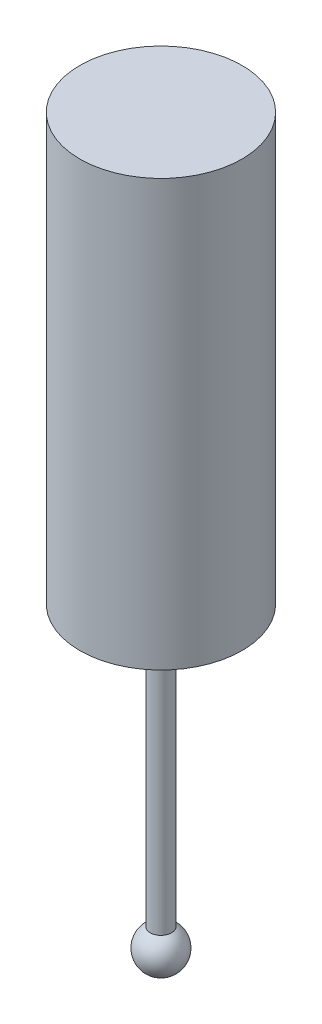
ISO-10303-21;
HEADER;
FILE_DESCRIPTION(('STEP AP214'),'2;1');
FILE_NAME('part.step','',(''),(''),'','','');
FILE_SCHEMA(('AUTOMOTIVE_DESIGN { 1 0 10303 214 1 1 1 1 }'));
ENDSEC;
DATA;
#1=APPLICATION_CONTEXT('core data for automotive mechanical design processes');
#2=APPLICATION_PROTOCOL_DEFINITION('international standard','automotive_design',2000,#1);
#3=PRODUCT_CONTEXT('',#1,'mechanical');
#4=PRODUCT('Part','Part','',(#3));
#5=PRODUCT_RELATED_PRODUCT_CATEGORY('part','',(#4));
#6=PRODUCT_DEFINITION_FORMATION('','',#4);
#7=PRODUCT_DEFINITION_CONTEXT('part definition',#1,'design');
#8=PRODUCT_DEFINITION('design','',#6,#7);
#9=PRODUCT_DEFINITION_SHAPE('','',#8);
#10=(LENGTH_UNIT() NAMED_UNIT(*) SI_UNIT(.MILLI.,.METRE.));
#11=(NAMED_UNIT(*) PLANE_ANGLE_UNIT() SI_UNIT($,.RADIAN.));
#12=(NAMED_UNIT(*) SI_UNIT($,.STERADIAN.) SOLID_ANGLE_UNIT());
#13=UNCERTAINTY_MEASURE_WITH_UNIT(LENGTH_MEASURE(1.E-05),#10,'distance_accuracy_value','');
#14=(GEOMETRIC_REPRESENTATION_CONTEXT(3) GLOBAL_UNCERTAINTY_ASSIGNED_CONTEXT((#13)) GLOBAL_UNIT_ASSIGNED_CONTEXT((#10,
#11,#12)) REPRESENTATION_CONTEXT('',''));
#15=CARTESIAN_POINT('',(0.,0.,0.));
#16=DIRECTION('',(0.,0.,1.));
#17=DIRECTION('',(1.,0.,0.));
#18=AXIS2_PLACEMENT_3D('',#15,#16,#17);
#19=CARTESIAN_POINT('',(0.,70.,0.));
#20=DIRECTION('',(0.,1.,0.));
#21=DIRECTION('',(0.,0.,1.));
#22=AXIS2_PLACEMENT_3D('',#19,#20,#21);
#23=PLANE('',#22);
#24=CARTESIAN_POINT('',(0.,70.,0.));
#25=DIRECTION('',(0.,1.,0.));
#26=DIRECTION('',(0.,0.,1.));
#27=AXIS2_PLACEMENT_3D('',#24,#25,#26);
#28=CIRCLE('',#27,19.05);
#29=CARTESIAN_POINT('',(0.,70.,19.05));
#30=VERTEX_POINT('',#29);
#31=EDGE_CURVE('E40',#30,#30,#28,.T.);
#32=ORIENTED_EDGE('',*,*,#31,.F.);
#33=EDGE_LOOP('',(#32));
#34=FACE_BOUND('',#33,.T.);
#35=CARTESIAN_POINT('',(0.,69.9999999999932,0.));
#36=DIRECTION('',(0.,1.,0.));
#37=DIRECTION('',(0.,0.,1.));
#38=AXIS2_PLACEMENT_3D('',#35,#36,#37);
#39=CIRCLE('',#38,2.5);
#40=CARTESIAN_POINT('',(0.,69.9999999999932,2.5));
#41=VERTEX_POINT('',#40);
#42=EDGE_CURVE('E10',#41,#41,#39,.F.);
#43=ORIENTED_EDGE('',*,*,#42,.F.);
#44=EDGE_LOOP('',(#43));
#45=FACE_BOUND('',#44,.T.);
#46=ADVANCED_FACE('F29',(#34,#45),#23,.F.);
#47=CARTESIAN_POINT('',(0.,170.,0.));
#48=DIRECTION('',(0.,-1.,0.));
#49=DIRECTION('',(0.,0.,-1.));
#50=AXIS2_PLACEMENT_3D('',#47,#48,#49);
#51=CYLINDRICAL_SURFACE('',#50,19.05);
#52=CARTESIAN_POINT('',(0.,170.,0.));
#53=DIRECTION('',(0.,1.,0.));
#54=DIRECTION('',(0.,0.,1.));
#55=AXIS2_PLACEMENT_3D('',#52,#53,#54);
#56=CIRCLE('',#55,19.05);
#57=CARTESIAN_POINT('',(0.,170.,19.05));
#58=VERTEX_POINT('',#57);
#59=EDGE_CURVE('E36',#58,#58,#56,.T.);
#60=ORIENTED_EDGE('',*,*,#59,.F.);
#61=EDGE_LOOP('',(#60));
#62=FACE_BOUND('',#61,.T.);
#63=ORIENTED_EDGE('',*,*,#31,.T.);
#64=EDGE_LOOP('',(#63));
#65=FACE_BOUND('',#64,.T.);
#66=ADVANCED_FACE('F31',(#62,#65),#51,.T.);
#67=CARTESIAN_POINT('',(0.,170.,0.));
#68=DIRECTION('',(0.,1.,0.));
#69=DIRECTION('',(0.,0.,1.));
#70=AXIS2_PLACEMENT_3D('',#67,#68,#69);
#71=PLANE('',#70);
#72=ORIENTED_EDGE('',*,*,#59,.T.);
#73=EDGE_LOOP('',(#72));
#74=FACE_BOUND('',#73,.T.);
#75=ADVANCED_FACE('F58',(#74),#71,.T.);
#76=CARTESIAN_POINT('',(0.,-500000.,0.));
#77=DIRECTION('',(0.,1.,0.));
#78=DIRECTION('',(0.,0.,1.));
#79=AXIS2_PLACEMENT_3D('',#76,#77,#78);
#80=CYLINDRICAL_SURFACE('',#79,2.5);
#81=CARTESIAN_POINT('',(0.,4.33012701892219,0.));
#82=DIRECTION('',(0.,-1.,0.));
#83=DIRECTION('',(0.,0.,-1.));
#84=AXIS2_PLACEMENT_3D('',#81,#82,#83);
#85=CIRCLE('',#84,2.5);
#86=CARTESIAN_POINT('',(0.,4.33012701892219,-2.5));
#87=VERTEX_POINT('',#86);
#88=EDGE_CURVE('E45',#87,#87,#85,.F.);
#89=ORIENTED_EDGE('',*,*,#88,.T.);
#90=EDGE_LOOP('',(#89));
#91=FACE_BOUND('',#90,.T.);
#92=ORIENTED_EDGE('',*,*,#42,.T.);
#93=EDGE_LOOP('',(#92));
#94=FACE_BOUND('',#93,.T.);
#95=ADVANCED_FACE('F50',(#91,#94),#80,.T.);
#96=CARTESIAN_POINT('',(0.,0.,0.));
#97=DIRECTION('',(-1.,0.,0.));
#98=DIRECTION('',(0.,0.,-1.));
#99=AXIS2_PLACEMENT_3D('',#96,#97,#98);
#100=SPHERICAL_SURFACE('',#99,5.);
#101=CARTESIAN_POINT('',(0.,0.,0.));
#102=DIRECTION('',(0.,-1.,0.));
#103=DIRECTION('',(0.,0.,-1.));
#104=AXIS2_PLACEMENT_3D('',#101,#102,#103);
#105=SPHERICAL_SURFACE('',#104,5.);
#106=ORIENTED_EDGE('',*,*,#88,.F.);
#107=EDGE_LOOP('',(#106));
#108=FACE_BOUND('',#107,.T.);
#109=ADVANCED_FACE('F52',(#108),#105,.T.);
#110=CLOSED_SHELL('',(#46,#66,#75,#95,#109));
#111=MANIFOLD_SOLID_BREP('B2',#110);
#112=ADVANCED_BREP_SHAPE_REPRESENTATION('',(#18,#111),#14);
#113=SHAPE_DEFINITION_REPRESENTATION(#9,#112);
ENDSEC;
END-ISO-10303-21;
